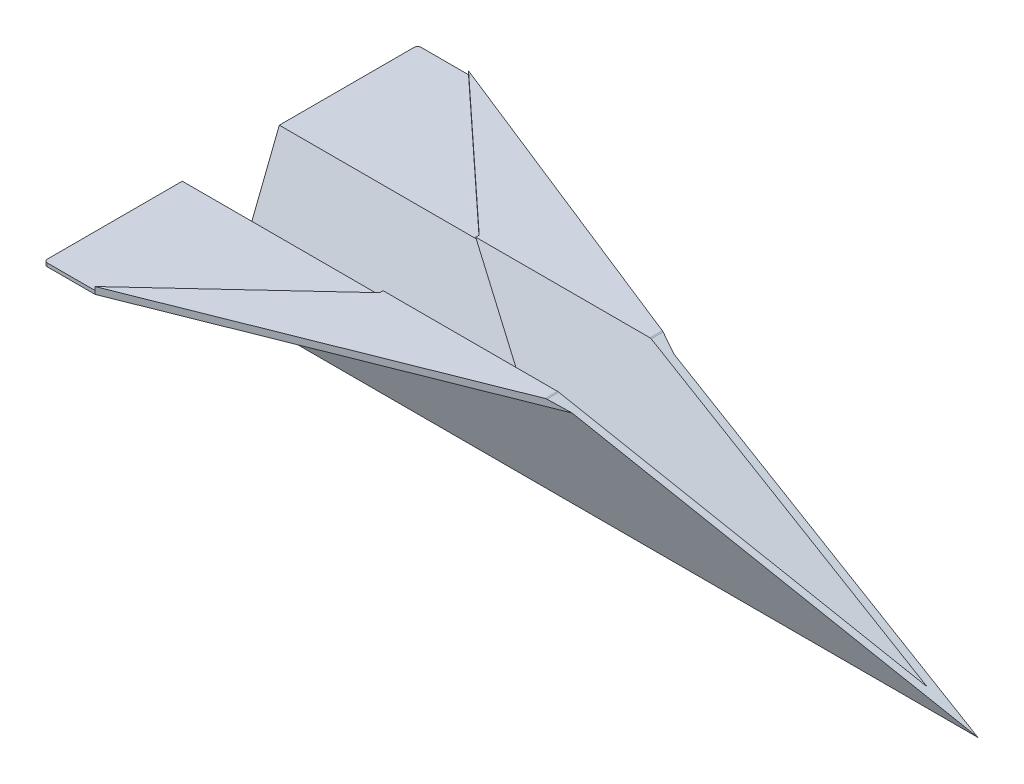
ISO-10303-21;
HEADER;
FILE_DESCRIPTION(('STEP AP214'),'2;1');
FILE_NAME('part.step','',(''),(''),'','','');
FILE_SCHEMA(('AUTOMOTIVE_DESIGN { 1 0 10303 214 1 1 1 1 }'));
ENDSEC;
DATA;
#1=APPLICATION_CONTEXT('core data for automotive mechanical design processes');
#2=APPLICATION_PROTOCOL_DEFINITION('international standard','automotive_design',2000,#1);
#3=PRODUCT_CONTEXT('',#1,'mechanical');
#4=PRODUCT('Part','Part','',(#3));
#5=PRODUCT_RELATED_PRODUCT_CATEGORY('part','',(#4));
#6=PRODUCT_DEFINITION_FORMATION('','',#4);
#7=PRODUCT_DEFINITION_CONTEXT('part definition',#1,'design');
#8=PRODUCT_DEFINITION('design','',#6,#7);
#9=PRODUCT_DEFINITION_SHAPE('','',#8);
#10=(LENGTH_UNIT() NAMED_UNIT(*) SI_UNIT(.MILLI.,.METRE.));
#11=(NAMED_UNIT(*) PLANE_ANGLE_UNIT() SI_UNIT($,.RADIAN.));
#12=(NAMED_UNIT(*) SI_UNIT($,.STERADIAN.) SOLID_ANGLE_UNIT());
#13=UNCERTAINTY_MEASURE_WITH_UNIT(LENGTH_MEASURE(1.E-05),#10,'distance_accuracy_value','');
#14=(GEOMETRIC_REPRESENTATION_CONTEXT(3) GLOBAL_UNCERTAINTY_ASSIGNED_CONTEXT((#13)) GLOBAL_UNIT_ASSIGNED_CONTEXT((#10,
#11,#12)) REPRESENTATION_CONTEXT('',''));
#15=CARTESIAN_POINT('',(0.,0.,0.));
#16=DIRECTION('',(0.,0.,1.));
#17=DIRECTION('',(1.,0.,0.));
#18=AXIS2_PLACEMENT_3D('',#15,#16,#17);
#19=CARTESIAN_POINT('',(279.4,0.,69.85));
#20=DIRECTION('',(0.,-1.,0.));
#21=DIRECTION('',(0.,0.,-1.));
#22=AXIS2_PLACEMENT_3D('',#19,#20,#21);
#23=PLANE('',#22);
#24=DIRECTION('',(0.929112902310387,0.,-0.369796180024035));
#25=VECTOR('',#24,1.);
#26=CARTESIAN_POINT('',(146.685,0.,19.05));
#27=LINE('',#26,#25);
#28=CARTESIAN_POINT('',(19.05,0.,69.85));
#29=VERTEX_POINT('',#28);
#30=CARTESIAN_POINT('',(139.476257778346,0.,21.9191511329964));
#31=VERTEX_POINT('',#30);
#32=EDGE_CURVE('E201',#29,#31,#27,.T.);
#33=ORIENTED_EDGE('',*,*,#32,.T.);
#34=DIRECTION('',(0.,0.,1.));
#35=VECTOR('',#34,1.);
#36=CARTESIAN_POINT('',(139.476257778346,0.,69.85));
#37=LINE('',#36,#35);
#38=CARTESIAN_POINT('',(139.476257778346,0.,17.3219045543068));
#39=VERTEX_POINT('',#38);
#40=EDGE_CURVE('E41',#31,#39,#37,.F.);
#41=ORIENTED_EDGE('',*,*,#40,.T.);
#42=DIRECTION('',(-1.,0.,0.));
#43=VECTOR('',#42,1.);
#44=CARTESIAN_POINT('',(279.4,0.,17.3219045543068));
#45=LINE('',#44,#43);
#46=CARTESIAN_POINT('',(74.2518042173273,0.,17.3219045543068));
#47=VERTEX_POINT('',#46);
#48=EDGE_CURVE('E262',#39,#47,#45,.T.);
#49=ORIENTED_EDGE('',*,*,#48,.T.);
#50=DIRECTION('',(0.,0.,-1.));
#51=VECTOR('',#50,1.);
#52=CARTESIAN_POINT('',(74.2518042173274,0.,69.85));
#53=LINE('',#52,#51);
#54=CARTESIAN_POINT('',(74.2518042173274,0.,18.640448736497));
#55=VERTEX_POINT('',#54);
#56=EDGE_CURVE('E212',#55,#47,#53,.T.);
#57=ORIENTED_EDGE('',*,*,#56,.F.);
#58=DIRECTION('',(0.733119661280728,0.,-0.680099670815705));
#59=VECTOR('',#58,1.);
#60=CARTESIAN_POINT('',(74.2518042173274,0.,18.640448736497));
#61=LINE('',#60,#59);
#62=EDGE_CURVE('E420',#29,#55,#61,.T.);
#63=ORIENTED_EDGE('',*,*,#62,.F.);
#64=EDGE_LOOP('',(#33,#41,#49,#57,#63));
#65=FACE_BOUND('',#64,.T.);
#66=ADVANCED_FACE('F33',(#65),#23,.F.);
#67=CARTESIAN_POINT('',(279.4,0.,17.3219045543068));
#68=DIRECTION('',(0.,-0.367166534736048,0.930155221331323));
#69=DIRECTION('',(0.,-0.930155221331323,-0.367166534736048));
#70=AXIS2_PLACEMENT_3D('',#67,#68,#69);
#71=PLANE('',#70);
#72=ORIENTED_EDGE('',*,*,#48,.F.);
#73=CARTESIAN_POINT('',(139.476257778346,-1.27,16.8205887648331));
#74=DIRECTION('',(0.,-0.367166534736048,0.930155221331323));
#75=DIRECTION('',(0.,0.930155221331323,0.367166534736048));
#76=AXIS2_PLACEMENT_3D('',#73,#74,#75);
#77=ELLIPSE('',#76,1.3653635123203,1.27);
#78=CARTESIAN_POINT('',(139.910271468467,-0.0764623521696817,17.2917220468713));
#79=VERTEX_POINT('',#78);
#80=EDGE_CURVE('E11',#39,#79,#77,.F.);
#81=ORIENTED_EDGE('',*,*,#80,.T.);
#82=DIRECTION('',(0.931357382673153,-0.338675411881146,-0.133687662584663));
#83=VECTOR('',#82,1.);
#84=CARTESIAN_POINT('',(260.879492424092,-44.0652699723971,-0.072280961113131));
#85=LINE('',#84,#83);
#86=CARTESIAN_POINT('',(260.375935061671,-43.8821582042438,0.));
#87=VERTEX_POINT('',#86);
#88=EDGE_CURVE('E227',#79,#87,#85,.T.);
#89=ORIENTED_EDGE('',*,*,#88,.T.);
#90=DIRECTION('',(-1.,0.,0.));
#91=VECTOR('',#90,1.);
#92=CARTESIAN_POINT('',(279.4,-43.8821582042438,0.));
#93=LINE('',#92,#91);
#94=CARTESIAN_POINT('',(118.133962421571,-43.8821582042438,0.));
#95=VERTEX_POINT('',#94);
#96=EDGE_CURVE('E245',#87,#95,#93,.T.);
#97=ORIENTED_EDGE('',*,*,#96,.T.);
#98=DIRECTION('',(0.681073584212537,-0.681073584212535,-0.268844835873369));
#99=VECTOR('',#98,1.);
#100=CARTESIAN_POINT('',(169.412098052914,-95.1602938355861,-20.2413693281614));
#101=LINE('',#100,#99);
#102=EDGE_CURVE('E337',#47,#95,#101,.T.);
#103=ORIENTED_EDGE('',*,*,#102,.F.);
#104=EDGE_LOOP('',(#72,#81,#89,#97,#103));
#105=FACE_BOUND('',#104,.T.);
#106=ADVANCED_FACE('F354',(#105),#71,.F.);
#107=CARTESIAN_POINT('',(279.4,0.,-17.3219045543068));
#108=DIRECTION('',(0.,-1.,0.));
#109=DIRECTION('',(0.,0.,-1.));
#110=AXIS2_PLACEMENT_3D('',#107,#108,#109);
#111=PLANE('',#110);
#112=DIRECTION('',(-1.,0.,0.));
#113=VECTOR('',#112,1.);
#114=CARTESIAN_POINT('',(279.4,0.,-17.3219045543068));
#115=LINE('',#114,#113);
#116=CARTESIAN_POINT('',(139.476257778346,0.,-17.3219045543068));
#117=VERTEX_POINT('',#116);
#118=CARTESIAN_POINT('',(74.2518042173274,0.,-17.3219045543068));
#119=VERTEX_POINT('',#118);
#120=EDGE_CURVE('E248',#117,#119,#115,.T.);
#121=ORIENTED_EDGE('',*,*,#120,.F.);
#122=DIRECTION('',(0.,0.,1.));
#123=VECTOR('',#122,1.);
#124=CARTESIAN_POINT('',(139.476257778346,0.,-17.3219045543068));
#125=LINE('',#124,#123);
#126=CARTESIAN_POINT('',(139.476257778346,0.,-21.9191511329964));
#127=VERTEX_POINT('',#126);
#128=EDGE_CURVE('E304',#117,#127,#125,.F.);
#129=ORIENTED_EDGE('',*,*,#128,.T.);
#130=DIRECTION('',(0.929112902310387,0.,0.369796180024035));
#131=VECTOR('',#130,1.);
#132=CARTESIAN_POINT('',(146.685,0.,-19.05));
#133=LINE('',#132,#131);
#134=CARTESIAN_POINT('',(19.05,0.,-69.85));
#135=VERTEX_POINT('',#134);
#136=EDGE_CURVE('E210',#135,#127,#133,.T.);
#137=ORIENTED_EDGE('',*,*,#136,.F.);
#138=DIRECTION('',(-0.733119661280728,0.,-0.680099670815705));
#139=VECTOR('',#138,1.);
#140=CARTESIAN_POINT('',(19.05,0.,-69.85));
#141=LINE('',#140,#139);
#142=CARTESIAN_POINT('',(74.2518042173274,0.,-18.6404487364971));
#143=VERTEX_POINT('',#142);
#144=EDGE_CURVE('E333',#143,#135,#141,.T.);
#145=ORIENTED_EDGE('',*,*,#144,.F.);
#146=DIRECTION('',(0.,0.,-1.));
#147=VECTOR('',#146,1.);
#148=CARTESIAN_POINT('',(74.2518042173274,0.,-17.3219045543068));
#149=LINE('',#148,#147);
#150=EDGE_CURVE('E332',#119,#143,#149,.T.);
#151=ORIENTED_EDGE('',*,*,#150,.F.);
#152=EDGE_LOOP('',(#121,#129,#137,#145,#151));
#153=FACE_BOUND('',#152,.T.);
#154=ADVANCED_FACE('F329',(#153),#111,.F.);
#155=CARTESIAN_POINT('',(279.4,-43.8821582042438,0.));
#156=DIRECTION('',(0.,-0.367166534736049,-0.930155221331323));
#157=DIRECTION('',(0.,0.930155221331323,-0.367166534736049));
#158=AXIS2_PLACEMENT_3D('',#155,#156,#157);
#159=PLANE('',#158);
#160=DIRECTION('',(-0.931357382673153,0.338675411881146,-0.133687662584663));
#161=VECTOR('',#160,1.);
#162=CARTESIAN_POINT('',(276.877914539621,-49.8828780144078,2.36870518822261));
#163=LINE('',#162,#161);
#164=CARTESIAN_POINT('',(139.910271468467,-0.0764623521696747,-17.2917220468714));
#165=VERTEX_POINT('',#164);
#166=EDGE_CURVE('E224',#87,#165,#163,.T.);
#167=ORIENTED_EDGE('',*,*,#166,.T.);
#168=CARTESIAN_POINT('',(139.476257778346,-1.27,-16.8205887648331));
#169=DIRECTION('',(0.,-0.367166534736049,-0.930155221331323));
#170=DIRECTION('',(0.,-0.930155221331323,0.367166534736049));
#171=AXIS2_PLACEMENT_3D('',#168,#169,#170);
#172=ELLIPSE('',#171,1.3653635123203,1.27);
#173=EDGE_CURVE('E302',#165,#117,#172,.F.);
#174=ORIENTED_EDGE('',*,*,#173,.T.);
#175=ORIENTED_EDGE('',*,*,#120,.T.);
#176=DIRECTION('',(-0.681073584212537,0.681073584212535,-0.268844835873369));
#177=VECTOR('',#176,1.);
#178=CARTESIAN_POINT('',(192.939024504209,-118.687220286881,29.5283139799886));
#179=LINE('',#178,#177);
#180=EDGE_CURVE('E272',#95,#119,#179,.T.);
#181=ORIENTED_EDGE('',*,*,#180,.F.);
#182=ORIENTED_EDGE('',*,*,#96,.F.);
#183=EDGE_LOOP('',(#167,#174,#175,#181,#182));
#184=FACE_BOUND('',#183,.T.);
#185=ADVANCED_FACE('F324',(#184),#159,.F.);
#186=CARTESIAN_POINT('',(0.,0.,0.));
#187=DIRECTION('',(1.,0.,0.));
#188=DIRECTION('',(0.,0.,-1.));
#189=AXIS2_PLACEMENT_3D('',#186,#187,#188);
#190=PLANE('',#189);
#191=DIRECTION('',(0.,0.,1.));
#192=VECTOR('',#191,1.);
#193=CARTESIAN_POINT('',(0.,-1.27,69.85));
#194=LINE('',#193,#192);
#195=CARTESIAN_POINT('',(0.,-1.27,-68.58));
#196=VERTEX_POINT('',#195);
#197=CARTESIAN_POINT('',(0.,-1.26999999999999,-18.1391329470234));
#198=VERTEX_POINT('',#197);
#199=EDGE_CURVE('E186',#196,#198,#194,.T.);
#200=ORIENTED_EDGE('',*,*,#199,.F.);
#201=DIRECTION('',(0.,1.,0.));
#202=VECTOR('',#201,1.);
#203=CARTESIAN_POINT('',(0.,0.,-68.58));
#204=LINE('',#203,#202);
#205=CARTESIAN_POINT('',(0.,-2.54,-68.58));
#206=VERTEX_POINT('',#205);
#207=EDGE_CURVE('E287',#196,#206,#204,.F.);
#208=ORIENTED_EDGE('',*,*,#207,.T.);
#209=DIRECTION('',(0.,0.,-1.));
#210=VECTOR('',#209,1.);
#211=CARTESIAN_POINT('',(0.,-2.54,-19.05));
#212=LINE('',#211,#210);
#213=CARTESIAN_POINT('',(0.,-2.54,-19.05));
#214=VERTEX_POINT('',#213);
#215=EDGE_CURVE('E242',#214,#206,#212,.T.);
#216=ORIENTED_EDGE('',*,*,#215,.F.);
#217=DIRECTION('',(0.,0.930155221331323,-0.367166534736049));
#218=VECTOR('',#217,1.);
#219=CARTESIAN_POINT('',(0.,-50.8,0.));
#220=LINE('',#219,#218);
#221=CARTESIAN_POINT('',(0.,-50.8,0.));
#222=VERTEX_POINT('',#221);
#223=EDGE_CURVE('E239',#222,#214,#220,.T.);
#224=ORIENTED_EDGE('',*,*,#223,.F.);
#225=DIRECTION('',(0.,-0.930155221331323,-0.367166534736048));
#226=VECTOR('',#225,1.);
#227=CARTESIAN_POINT('',(0.,-2.54,19.05));
#228=LINE('',#227,#226);
#229=CARTESIAN_POINT('',(0.,-2.54,19.05));
#230=VERTEX_POINT('',#229);
#231=EDGE_CURVE('E237',#230,#222,#228,.T.);
#232=ORIENTED_EDGE('',*,*,#231,.F.);
#233=DIRECTION('',(0.,0.,-1.));
#234=VECTOR('',#233,1.);
#235=CARTESIAN_POINT('',(0.,-2.54,69.85));
#236=LINE('',#235,#234);
#237=CARTESIAN_POINT('',(0.,-2.54,68.58));
#238=VERTEX_POINT('',#237);
#239=EDGE_CURVE('E235',#238,#230,#236,.T.);
#240=ORIENTED_EDGE('',*,*,#239,.F.);
#241=DIRECTION('',(0.,-1.,0.));
#242=VECTOR('',#241,1.);
#243=CARTESIAN_POINT('',(0.,0.,68.58));
#244=LINE('',#243,#242);
#245=CARTESIAN_POINT('',(0.,-1.27,68.58));
#246=VERTEX_POINT('',#245);
#247=EDGE_CURVE('E285',#238,#246,#244,.F.);
#248=ORIENTED_EDGE('',*,*,#247,.T.);
#249=CARTESIAN_POINT('',(0.,-1.27,18.1391329470233));
#250=VERTEX_POINT('',#249);
#251=EDGE_CURVE('E423',#250,#246,#194,.T.);
#252=ORIENTED_EDGE('',*,*,#251,.F.);
#253=DIRECTION('',(0.,0.930155221331323,0.367166534736048));
#254=VECTOR('',#253,1.);
#255=CARTESIAN_POINT('',(0.,-6.36612089862391,16.1275062765139));
#256=LINE('',#255,#254);
#257=CARTESIAN_POINT('',(0.,-47.2224701324592,0.));
#258=VERTEX_POINT('',#257);
#259=EDGE_CURVE('E269',#258,#250,#256,.T.);
#260=ORIENTED_EDGE('',*,*,#259,.F.);
#261=DIRECTION('',(0.,0.930155221331323,-0.367166534736049));
#262=VECTOR('',#261,1.);
#263=CARTESIAN_POINT('',(0.,-47.2224701324592,0.));
#264=LINE('',#263,#262);
#265=EDGE_CURVE('E338',#258,#198,#264,.T.);
#266=ORIENTED_EDGE('',*,*,#265,.T.);
#267=EDGE_LOOP('',(#200,#208,#216,#224,#232,#240,#248,#252,#260,#266));
#268=FACE_BOUND('',#267,.T.);
#269=ADVANCED_FACE('F398',(#268),#190,.F.);
#270=CARTESIAN_POINT('',(279.4,0.,69.85));
#271=DIRECTION('',(0.,0.,-1.));
#272=DIRECTION('',(-1.,0.,0.));
#273=AXIS2_PLACEMENT_3D('',#270,#271,#272);
#274=PLANE('',#273);
#275=DIRECTION('',(1.,0.,0.));
#276=VECTOR('',#275,1.);
#277=CARTESIAN_POINT('',(19.05,-1.27,69.85));
#278=LINE('',#277,#276);
#279=CARTESIAN_POINT('',(1.27,-1.27,69.85));
#280=VERTEX_POINT('',#279);
#281=CARTESIAN_POINT('',(19.05,-1.27,69.85));
#282=VERTEX_POINT('',#281);
#283=EDGE_CURVE('E175',#280,#282,#278,.T.);
#284=ORIENTED_EDGE('',*,*,#283,.F.);
#285=DIRECTION('',(0.,-1.,0.));
#286=VECTOR('',#285,1.);
#287=CARTESIAN_POINT('',(1.26999999999999,0.,69.85));
#288=LINE('',#287,#286);
#289=CARTESIAN_POINT('',(1.26999999999999,-2.54,69.85));
#290=VERTEX_POINT('',#289);
#291=EDGE_CURVE('E291',#280,#290,#288,.T.);
#292=ORIENTED_EDGE('',*,*,#291,.T.);
#293=DIRECTION('',(-1.,0.,0.));
#294=VECTOR('',#293,1.);
#295=CARTESIAN_POINT('',(279.4,-2.54,69.85));
#296=LINE('',#295,#294);
#297=CARTESIAN_POINT('',(19.05,-2.54,69.85));
#298=VERTEX_POINT('',#297);
#299=EDGE_CURVE('E207',#298,#290,#296,.T.);
#300=ORIENTED_EDGE('',*,*,#299,.F.);
#301=DIRECTION('',(0.,1.,0.));
#302=VECTOR('',#301,1.);
#303=CARTESIAN_POINT('',(19.05,-50.8,69.85));
#304=LINE('',#303,#302);
#305=EDGE_CURVE('E199',#298,#282,#304,.T.);
#306=ORIENTED_EDGE('',*,*,#305,.T.);
#307=EDGE_LOOP('',(#284,#292,#300,#306));
#308=FACE_BOUND('',#307,.T.);
#309=ADVANCED_FACE('F205',(#308),#274,.F.);
#310=CARTESIAN_POINT('',(279.4,-2.54,69.85));
#311=DIRECTION('',(0.,1.,0.));
#312=DIRECTION('',(0.,0.,1.));
#313=AXIS2_PLACEMENT_3D('',#310,#311,#312);
#314=PLANE('',#313);
#315=ORIENTED_EDGE('',*,*,#299,.T.);
#316=CARTESIAN_POINT('',(1.26999999999999,-2.54,68.58));
#317=DIRECTION('',(0.,1.,0.));
#318=DIRECTION('',(0.,0.,1.));
#319=AXIS2_PLACEMENT_3D('',#316,#317,#318);
#320=CIRCLE('',#319,1.27);
#321=EDGE_CURVE('E293',#290,#238,#320,.F.);
#322=ORIENTED_EDGE('',*,*,#321,.T.);
#323=ORIENTED_EDGE('',*,*,#239,.T.);
#324=DIRECTION('',(-1.,0.,0.));
#325=VECTOR('',#324,1.);
#326=CARTESIAN_POINT('',(279.4,-2.54,19.05));
#327=LINE('',#326,#325);
#328=CARTESIAN_POINT('',(146.685,-2.54,19.05));
#329=VERTEX_POINT('',#328);
#330=EDGE_CURVE('E258',#329,#230,#327,.T.);
#331=ORIENTED_EDGE('',*,*,#330,.F.);
#332=DIRECTION('',(0.929112902310387,0.,-0.369796180024035));
#333=VECTOR('',#332,1.);
#334=CARTESIAN_POINT('',(243.797341937138,-2.54,-19.6016783829406));
#335=LINE('',#334,#333);
#336=EDGE_CURVE('E208',#298,#329,#335,.T.);
#337=ORIENTED_EDGE('',*,*,#336,.F.);
#338=EDGE_LOOP('',(#315,#322,#323,#331,#337));
#339=FACE_BOUND('',#338,.T.);
#340=ADVANCED_FACE('F385',(#339),#314,.F.);
#341=CARTESIAN_POINT('',(139.7,0.,-69.85));
#342=DIRECTION('',(-0.341743063086704,-0.939793423488437,0.));
#343=DIRECTION('',(0.939793423488437,-0.341743063086704,0.));
#344=AXIS2_PLACEMENT_3D('',#341,#342,#343);
#345=PLANE('',#344);
#346=DIRECTION('',(-0.880231447134228,0.320084162594265,-0.350340874481285));
#347=VECTOR('',#346,1.);
#348=CARTESIAN_POINT('',(124.891572426707,5.38488275392484,-27.7240010241964));
#349=LINE('',#348,#347);
#350=CARTESIAN_POINT('',(146.685,-2.54,-19.05));
#351=VERTEX_POINT('',#350);
#352=CARTESIAN_POINT('',(139.910271468467,-0.0764623521696843,-21.7464093657844));
#353=VERTEX_POINT('',#352);
#354=EDGE_CURVE('E264',#351,#353,#349,.T.);
#355=ORIENTED_EDGE('',*,*,#354,.T.);
#356=DIRECTION('',(0.,0.,1.));
#357=VECTOR('',#356,1.);
#358=CARTESIAN_POINT('',(139.910271468467,-0.0764623521696838,-69.85));
#359=LINE('',#358,#357);
#360=EDGE_CURVE('E299',#353,#165,#359,.T.);
#361=ORIENTED_EDGE('',*,*,#360,.T.);
#362=ORIENTED_EDGE('',*,*,#166,.F.);
#363=ORIENTED_EDGE('',*,*,#88,.F.);
#364=DIRECTION('',(0.,0.,1.));
#365=VECTOR('',#364,1.);
#366=CARTESIAN_POINT('',(139.910271468467,-0.0764623521696838,-69.85));
#367=LINE('',#366,#365);
#368=CARTESIAN_POINT('',(139.910271468467,-0.0764623521696851,21.7464093657844));
#369=VERTEX_POINT('',#368);
#370=EDGE_CURVE('E296',#79,#369,#367,.T.);
#371=ORIENTED_EDGE('',*,*,#370,.T.);
#372=DIRECTION('',(-0.880231447134228,0.320084162594265,0.350340874481285));
#373=VECTOR('',#372,1.);
#374=CARTESIAN_POINT('',(167.972405801117,-10.2808748367697,10.5774006761725));
#375=LINE('',#374,#373);
#376=EDGE_CURVE('E267',#329,#369,#375,.T.);
#377=ORIENTED_EDGE('',*,*,#376,.F.);
#378=DIRECTION('',(-0.931357382673153,0.338675411881146,0.133687662584663));
#379=VECTOR('',#378,1.);
#380=CARTESIAN_POINT('',(261.805517802887,-44.4020064737772,2.52552376035109));
#381=LINE('',#380,#379);
#382=CARTESIAN_POINT('',(279.4,-50.8,0.));
#383=VERTEX_POINT('',#382);
#384=EDGE_CURVE('E232',#383,#329,#381,.T.);
#385=ORIENTED_EDGE('',*,*,#384,.F.);
#386=DIRECTION('',(0.931357382673153,-0.338675411881146,0.133687662584663));
#387=VECTOR('',#386,1.);
#388=CARTESIAN_POINT('',(279.4,-50.8,0.));
#389=LINE('',#388,#387);
#390=EDGE_CURVE('E229',#351,#383,#389,.T.);
#391=ORIENTED_EDGE('',*,*,#390,.F.);
#392=EDGE_LOOP('',(#355,#361,#362,#363,#371,#377,#385,#391));
#393=FACE_BOUND('',#392,.T.);
#394=ADVANCED_FACE('F318',(#393),#345,.F.);
#395=CARTESIAN_POINT('',(279.4,-2.54,19.05));
#396=DIRECTION('',(0.,0.367166534736048,-0.930155221331323));
#397=DIRECTION('',(0.,0.930155221331323,0.367166534736048));
#398=AXIS2_PLACEMENT_3D('',#395,#396,#397);
#399=PLANE('',#398);
#400=DIRECTION('',(-1.,0.,0.));
#401=VECTOR('',#400,1.);
#402=CARTESIAN_POINT('',(279.4,-50.8,0.));
#403=LINE('',#402,#401);
#404=EDGE_CURVE('E255',#383,#222,#403,.T.);
#405=ORIENTED_EDGE('',*,*,#404,.F.);
#406=ORIENTED_EDGE('',*,*,#384,.T.);
#407=ORIENTED_EDGE('',*,*,#330,.T.);
#408=ORIENTED_EDGE('',*,*,#231,.T.);
#409=EDGE_LOOP('',(#405,#406,#407,#408));
#410=FACE_BOUND('',#409,.T.);
#411=ADVANCED_FACE('F390',(#410),#399,.F.);
#412=CARTESIAN_POINT('',(279.4,-50.8,0.));
#413=DIRECTION('',(0.,0.367166534736049,0.930155221331323));
#414=DIRECTION('',(0.,-0.930155221331323,0.367166534736049));
#415=AXIS2_PLACEMENT_3D('',#412,#413,#414);
#416=PLANE('',#415);
#417=DIRECTION('',(-1.,0.,0.));
#418=VECTOR('',#417,1.);
#419=CARTESIAN_POINT('',(279.4,-2.54,-19.05));
#420=LINE('',#419,#418);
#421=EDGE_CURVE('E253',#351,#214,#420,.T.);
#422=ORIENTED_EDGE('',*,*,#421,.F.);
#423=ORIENTED_EDGE('',*,*,#390,.T.);
#424=ORIENTED_EDGE('',*,*,#404,.T.);
#425=ORIENTED_EDGE('',*,*,#223,.T.);
#426=EDGE_LOOP('',(#422,#423,#424,#425));
#427=FACE_BOUND('',#426,.T.);
#428=ADVANCED_FACE('F394',(#427),#416,.F.);
#429=CARTESIAN_POINT('',(279.4,-2.54,-19.05));
#430=DIRECTION('',(0.,1.,0.));
#431=DIRECTION('',(0.,0.,1.));
#432=AXIS2_PLACEMENT_3D('',#429,#430,#431);
#433=PLANE('',#432);
#434=ORIENTED_EDGE('',*,*,#215,.T.);
#435=CARTESIAN_POINT('',(1.26999999999999,-2.54,-68.58));
#436=DIRECTION('',(0.,1.,0.));
#437=DIRECTION('',(0.,0.,1.));
#438=AXIS2_PLACEMENT_3D('',#435,#436,#437);
#439=CIRCLE('',#438,1.27);
#440=CARTESIAN_POINT('',(1.26999999999999,-2.54,-69.85));
#441=VERTEX_POINT('',#440);
#442=EDGE_CURVE('E289',#206,#441,#439,.F.);
#443=ORIENTED_EDGE('',*,*,#442,.T.);
#444=DIRECTION('',(-1.,0.,0.));
#445=VECTOR('',#444,1.);
#446=CARTESIAN_POINT('',(279.4,-2.54,-69.85));
#447=LINE('',#446,#445);
#448=CARTESIAN_POINT('',(19.05,-2.54,-69.85));
#449=VERTEX_POINT('',#448);
#450=EDGE_CURVE('E250',#449,#441,#447,.T.);
#451=ORIENTED_EDGE('',*,*,#450,.F.);
#452=DIRECTION('',(0.929112902310387,0.,0.369796180024035));
#453=VECTOR('',#452,1.);
#454=CARTESIAN_POINT('',(261.251327963078,-2.54,26.5485384927673));
#455=LINE('',#454,#453);
#456=EDGE_CURVE('E221',#449,#351,#455,.T.);
#457=ORIENTED_EDGE('',*,*,#456,.T.);
#458=ORIENTED_EDGE('',*,*,#421,.T.);
#459=EDGE_LOOP('',(#434,#443,#451,#457,#458));
#460=FACE_BOUND('',#459,.T.);
#461=ADVANCED_FACE('F402',(#460),#433,.F.);
#462=CARTESIAN_POINT('',(279.4,-2.54,-69.85));
#463=DIRECTION('',(0.,0.,1.));
#464=DIRECTION('',(1.,0.,0.));
#465=AXIS2_PLACEMENT_3D('',#462,#463,#464);
#466=PLANE('',#465);
#467=ORIENTED_EDGE('',*,*,#450,.T.);
#468=DIRECTION('',(0.,1.,0.));
#469=VECTOR('',#468,1.);
#470=CARTESIAN_POINT('',(1.26999999999999,-2.54,-69.85));
#471=LINE('',#470,#469);
#472=CARTESIAN_POINT('',(1.26999999999999,-1.27,-69.85));
#473=VERTEX_POINT('',#472);
#474=EDGE_CURVE('E280',#441,#473,#471,.T.);
#475=ORIENTED_EDGE('',*,*,#474,.T.);
#476=DIRECTION('',(-1.,0.,0.));
#477=VECTOR('',#476,1.);
#478=CARTESIAN_POINT('',(0.,-1.27,-69.85));
#479=LINE('',#478,#477);
#480=CARTESIAN_POINT('',(19.05,-1.27,-69.85));
#481=VERTEX_POINT('',#480);
#482=EDGE_CURVE('E202',#481,#473,#479,.T.);
#483=ORIENTED_EDGE('',*,*,#482,.F.);
#484=DIRECTION('',(0.,1.,0.));
#485=VECTOR('',#484,1.);
#486=CARTESIAN_POINT('',(19.05,-50.8,-69.85));
#487=LINE('',#486,#485);
#488=EDGE_CURVE('E218',#449,#481,#487,.T.);
#489=ORIENTED_EDGE('',*,*,#488,.F.);
#490=EDGE_LOOP('',(#467,#475,#483,#489));
#491=FACE_BOUND('',#490,.T.);
#492=ADVANCED_FACE('F408',(#491),#466,.F.);
#493=CARTESIAN_POINT('',(146.685,-50.8,-19.05));
#494=DIRECTION('',(-0.369796180024035,0.,0.929112902310387));
#495=DIRECTION('',(0.929112902310387,0.,0.369796180024035));
#496=AXIS2_PLACEMENT_3D('',#493,#494,#495);
#497=PLANE('',#496);
#498=ORIENTED_EDGE('',*,*,#136,.T.);
#499=CARTESIAN_POINT('',(139.476257778346,-1.27,-21.9191511329964));
#500=DIRECTION('',(-0.369796180024035,0.,0.929112902310387));
#501=DIRECTION('',(0.929112902310388,0.,0.369796180024035));
#502=AXIS2_PLACEMENT_3D('',#499,#500,#501);
#503=ELLIPSE('',#502,1.3668952361354,1.27);
#504=EDGE_CURVE('E306',#127,#353,#503,.F.);
#505=ORIENTED_EDGE('',*,*,#504,.T.);
#506=ORIENTED_EDGE('',*,*,#354,.F.);
#507=ORIENTED_EDGE('',*,*,#456,.F.);
#508=ORIENTED_EDGE('',*,*,#488,.T.);
#509=DIRECTION('',(0.,1.,0.));
#510=VECTOR('',#509,1.);
#511=CARTESIAN_POINT('',(19.05,-1.27,-69.85));
#512=LINE('',#511,#510);
#513=EDGE_CURVE('E424',#481,#135,#512,.T.);
#514=ORIENTED_EDGE('',*,*,#513,.T.);
#515=EDGE_LOOP('',(#498,#505,#506,#507,#508,#514));
#516=FACE_BOUND('',#515,.T.);
#517=ADVANCED_FACE('F310',(#516),#497,.F.);
#518=CARTESIAN_POINT('',(146.685,-50.8,19.05));
#519=DIRECTION('',(0.369796180024035,0.,0.929112902310387));
#520=DIRECTION('',(0.929112902310387,0.,-0.369796180024035));
#521=AXIS2_PLACEMENT_3D('',#518,#519,#520);
#522=PLANE('',#521);
#523=ORIENTED_EDGE('',*,*,#376,.T.);
#524=CARTESIAN_POINT('',(139.476257778346,-1.27,21.9191511329964));
#525=DIRECTION('',(0.369796180024035,0.,0.929112902310387));
#526=DIRECTION('',(-0.929112902310388,0.,0.369796180024035));
#527=AXIS2_PLACEMENT_3D('',#524,#525,#526);
#528=ELLIPSE('',#527,1.3668952361354,1.27);
#529=EDGE_CURVE('E55',#369,#31,#528,.T.);
#530=ORIENTED_EDGE('',*,*,#529,.T.);
#531=ORIENTED_EDGE('',*,*,#32,.F.);
#532=DIRECTION('',(0.,1.,0.));
#533=VECTOR('',#532,1.);
#534=CARTESIAN_POINT('',(19.05,-1.27,69.85));
#535=LINE('',#534,#533);
#536=EDGE_CURVE('E192',#282,#29,#535,.T.);
#537=ORIENTED_EDGE('',*,*,#536,.F.);
#538=ORIENTED_EDGE('',*,*,#305,.F.);
#539=ORIENTED_EDGE('',*,*,#336,.T.);
#540=EDGE_LOOP('',(#523,#530,#531,#537,#538,#539));
#541=FACE_BOUND('',#540,.T.);
#542=ADVANCED_FACE('F198',(#541),#522,.T.);
#543=CARTESIAN_POINT('',(37.1259021086636,37.1259021086637,0.));
#544=DIRECTION('',(-0.707106781186546,-0.707106781186549,0.));
#545=DIRECTION('',(0.707106781186549,-0.707106781186546,0.));
#546=AXIS2_PLACEMENT_3D('',#543,#544,#545);
#547=PLANE('',#546);
#548=ORIENTED_EDGE('',*,*,#56,.T.);
#549=ORIENTED_EDGE('',*,*,#102,.T.);
#550=ORIENTED_EDGE('',*,*,#180,.T.);
#551=ORIENTED_EDGE('',*,*,#150,.T.);
#552=DIRECTION('',(-0.681073584212537,0.681073584212535,-0.268844835873369));
#553=VECTOR('',#552,1.);
#554=CARTESIAN_POINT('',(121.474274349787,-47.2224701324592,0.));
#555=LINE('',#554,#553);
#556=CARTESIAN_POINT('',(121.474274349787,-47.2224701324592,0.));
#557=VERTEX_POINT('',#556);
#558=EDGE_CURVE('E345',#557,#143,#555,.T.);
#559=ORIENTED_EDGE('',*,*,#558,.F.);
#560=DIRECTION('',(0.681073584212538,-0.681073584212535,-0.268844835873369));
#561=VECTOR('',#560,1.);
#562=CARTESIAN_POINT('',(73.3537786052205,0.898025612106911,18.9949325307498));
#563=LINE('',#562,#561);
#564=EDGE_CURVE('E352',#55,#557,#563,.T.);
#565=ORIENTED_EDGE('',*,*,#564,.F.);
#566=EDGE_LOOP('',(#548,#549,#550,#551,#559,#565));
#567=FACE_BOUND('',#566,.T.);
#568=ADVANCED_FACE('F351',(#567),#547,.T.);
#569=CARTESIAN_POINT('',(121.474274349787,-47.2224701324592,0.));
#570=DIRECTION('',(0.,0.367166534736049,0.930155221331323));
#571=DIRECTION('',(0.,-0.930155221331323,0.367166534736049));
#572=AXIS2_PLACEMENT_3D('',#569,#570,#571);
#573=PLANE('',#572);
#574=DIRECTION('',(0.,0.930155221331323,-0.367166534736049));
#575=VECTOR('',#574,1.);
#576=CARTESIAN_POINT('',(74.2518042173274,-47.2224701324592,0.));
#577=LINE('',#576,#575);
#578=CARTESIAN_POINT('',(74.2518042173274,-1.27,-18.1391329470234));
#579=VERTEX_POINT('',#578);
#580=EDGE_CURVE('E432',#579,#143,#577,.T.);
#581=ORIENTED_EDGE('',*,*,#580,.F.);
#582=DIRECTION('',(1.,0.,0.));
#583=VECTOR('',#582,1.);
#584=CARTESIAN_POINT('',(121.474274349787,-1.27,-18.1391329470234));
#585=LINE('',#584,#583);
#586=EDGE_CURVE('E426',#198,#579,#585,.T.);
#587=ORIENTED_EDGE('',*,*,#586,.F.);
#588=ORIENTED_EDGE('',*,*,#265,.F.);
#589=DIRECTION('',(-1.,0.,0.));
#590=VECTOR('',#589,1.);
#591=CARTESIAN_POINT('',(121.474274349787,-47.2224701324592,0.));
#592=LINE('',#591,#590);
#593=EDGE_CURVE('E342',#557,#258,#592,.T.);
#594=ORIENTED_EDGE('',*,*,#593,.F.);
#595=ORIENTED_EDGE('',*,*,#558,.T.);
#596=EDGE_LOOP('',(#581,#587,#588,#594,#595));
#597=FACE_BOUND('',#596,.T.);
#598=ADVANCED_FACE('F439',(#597),#573,.T.);
#599=CARTESIAN_POINT('',(73.3537786052205,0.898025612106911,18.9949325307498));
#600=DIRECTION('',(0.,0.367166534736048,-0.930155221331323));
#601=DIRECTION('',(0.,0.930155221331323,0.367166534736048));
#602=AXIS2_PLACEMENT_3D('',#599,#600,#601);
#603=PLANE('',#602);
#604=DIRECTION('',(0.,-0.930155221331323,-0.367166534736048));
#605=VECTOR('',#604,1.);
#606=CARTESIAN_POINT('',(74.2518042173274,0.898025612106911,18.9949325307498));
#607=LINE('',#606,#605);
#608=CARTESIAN_POINT('',(74.2518042173274,-1.27,18.1391329470233));
#609=VERTEX_POINT('',#608);
#610=EDGE_CURVE('E277',#55,#609,#607,.T.);
#611=ORIENTED_EDGE('',*,*,#610,.F.);
#612=ORIENTED_EDGE('',*,*,#564,.T.);
#613=ORIENTED_EDGE('',*,*,#593,.T.);
#614=ORIENTED_EDGE('',*,*,#259,.T.);
#615=DIRECTION('',(-1.,0.,0.));
#616=VECTOR('',#615,1.);
#617=CARTESIAN_POINT('',(73.3537786052205,-1.27,18.1391329470233));
#618=LINE('',#617,#616);
#619=EDGE_CURVE('E275',#609,#250,#618,.T.);
#620=ORIENTED_EDGE('',*,*,#619,.F.);
#621=EDGE_LOOP('',(#611,#612,#613,#614,#620));
#622=FACE_BOUND('',#621,.T.);
#623=ADVANCED_FACE('F445',(#622),#603,.T.);
#624=CARTESIAN_POINT('',(0.,-1.27,0.));
#625=DIRECTION('',(0.,-1.,0.));
#626=DIRECTION('',(0.,0.,-1.));
#627=AXIS2_PLACEMENT_3D('',#624,#625,#626);
#628=PLANE('',#627);
#629=ORIENTED_EDGE('',*,*,#251,.T.);
#630=CARTESIAN_POINT('',(1.26999999999999,-1.27,68.58));
#631=DIRECTION('',(0.,-1.,0.));
#632=DIRECTION('',(0.,0.,-1.));
#633=AXIS2_PLACEMENT_3D('',#630,#631,#632);
#634=CIRCLE('',#633,1.27);
#635=EDGE_CURVE('E181',#246,#280,#634,.F.);
#636=ORIENTED_EDGE('',*,*,#635,.T.);
#637=ORIENTED_EDGE('',*,*,#283,.T.);
#638=DIRECTION('',(0.733119661280728,0.,-0.680099670815705));
#639=VECTOR('',#638,1.);
#640=CARTESIAN_POINT('',(74.2518042173274,-1.27,18.640448736497));
#641=LINE('',#640,#639);
#642=CARTESIAN_POINT('',(74.2518042173274,-1.27,18.640448736497));
#643=VERTEX_POINT('',#642);
#644=EDGE_CURVE('E179',#282,#643,#641,.T.);
#645=ORIENTED_EDGE('',*,*,#644,.T.);
#646=DIRECTION('',(0.,0.,-1.));
#647=VECTOR('',#646,1.);
#648=CARTESIAN_POINT('',(74.2518042173274,-1.27,-18.6404487364971));
#649=LINE('',#648,#647);
#650=EDGE_CURVE('E416',#643,#609,#649,.T.);
#651=ORIENTED_EDGE('',*,*,#650,.T.);
#652=ORIENTED_EDGE('',*,*,#619,.T.);
#653=EDGE_LOOP('',(#629,#636,#637,#645,#651,#652));
#654=FACE_BOUND('',#653,.T.);
#655=ADVANCED_FACE('F178',(#654),#628,.F.);
#656=CARTESIAN_POINT('',(74.2518042173274,-1.27,-18.6404487364971));
#657=DIRECTION('',(1.,0.,0.));
#658=DIRECTION('',(0.,0.,-1.));
#659=AXIS2_PLACEMENT_3D('',#656,#657,#658);
#660=PLANE('',#659);
#661=ORIENTED_EDGE('',*,*,#610,.T.);
#662=ORIENTED_EDGE('',*,*,#650,.F.);
#663=DIRECTION('',(0.,1.,0.));
#664=VECTOR('',#663,1.);
#665=CARTESIAN_POINT('',(74.2518042173274,-1.27,18.640448736497));
#666=LINE('',#665,#664);
#667=EDGE_CURVE('E194',#643,#55,#666,.T.);
#668=ORIENTED_EDGE('',*,*,#667,.T.);
#669=EDGE_LOOP('',(#661,#662,#668));
#670=FACE_BOUND('',#669,.T.);
#671=ADVANCED_FACE('F447',(#670),#660,.F.);
#672=CARTESIAN_POINT('',(74.2518042173274,-1.27,18.640448736497));
#673=DIRECTION('',(0.680099670815705,0.,0.733119661280728));
#674=DIRECTION('',(0.733119661280728,0.,-0.680099670815705));
#675=AXIS2_PLACEMENT_3D('',#672,#673,#674);
#676=PLANE('',#675);
#677=ORIENTED_EDGE('',*,*,#62,.T.);
#678=ORIENTED_EDGE('',*,*,#667,.F.);
#679=ORIENTED_EDGE('',*,*,#644,.F.);
#680=ORIENTED_EDGE('',*,*,#536,.T.);
#681=EDGE_LOOP('',(#677,#678,#679,#680));
#682=FACE_BOUND('',#681,.T.);
#683=ADVANCED_FACE('F191',(#682),#676,.F.);
#684=ORIENTED_EDGE('',*,*,#580,.T.);
#685=DIRECTION('',(0.,1.,0.));
#686=VECTOR('',#685,1.);
#687=CARTESIAN_POINT('',(74.2518042173274,-1.27,-18.6404487364971));
#688=LINE('',#687,#686);
#689=CARTESIAN_POINT('',(74.2518042173274,-1.27,-18.6404487364971));
#690=VERTEX_POINT('',#689);
#691=EDGE_CURVE('E427',#690,#143,#688,.T.);
#692=ORIENTED_EDGE('',*,*,#691,.F.);
#693=EDGE_CURVE('E196',#579,#690,#649,.T.);
#694=ORIENTED_EDGE('',*,*,#693,.F.);
#695=EDGE_LOOP('',(#684,#692,#694));
#696=FACE_BOUND('',#695,.T.);
#697=ADVANCED_FACE('F450',(#696),#660,.F.);
#698=ORIENTED_EDGE('',*,*,#482,.T.);
#699=CARTESIAN_POINT('',(1.26999999999999,-1.27,-68.58));
#700=DIRECTION('',(0.,-1.,0.));
#701=DIRECTION('',(0.,0.,-1.));
#702=AXIS2_PLACEMENT_3D('',#699,#700,#701);
#703=CIRCLE('',#702,1.27);
#704=EDGE_CURVE('E283',#473,#196,#703,.F.);
#705=ORIENTED_EDGE('',*,*,#704,.T.);
#706=ORIENTED_EDGE('',*,*,#199,.T.);
#707=ORIENTED_EDGE('',*,*,#586,.T.);
#708=ORIENTED_EDGE('',*,*,#693,.T.);
#709=DIRECTION('',(-0.733119661280728,0.,-0.680099670815705));
#710=VECTOR('',#709,1.);
#711=CARTESIAN_POINT('',(19.05,-1.27,-69.85));
#712=LINE('',#711,#710);
#713=EDGE_CURVE('E414',#690,#481,#712,.T.);
#714=ORIENTED_EDGE('',*,*,#713,.T.);
#715=EDGE_LOOP('',(#698,#705,#706,#707,#708,#714));
#716=FACE_BOUND('',#715,.T.);
#717=ADVANCED_FACE('F412',(#716),#628,.F.);
#718=CARTESIAN_POINT('',(19.05,-1.27,-69.85));
#719=DIRECTION('',(0.680099670815705,0.,-0.733119661280728));
#720=DIRECTION('',(-0.733119661280728,0.,-0.680099670815705));
#721=AXIS2_PLACEMENT_3D('',#718,#719,#720);
#722=PLANE('',#721);
#723=ORIENTED_EDGE('',*,*,#144,.T.);
#724=ORIENTED_EDGE('',*,*,#513,.F.);
#725=ORIENTED_EDGE('',*,*,#713,.F.);
#726=ORIENTED_EDGE('',*,*,#691,.T.);
#727=EDGE_LOOP('',(#723,#724,#725,#726));
#728=FACE_BOUND('',#727,.T.);
#729=ADVANCED_FACE('F377',(#728),#722,.F.);
#730=CARTESIAN_POINT('',(1.26999999999999,-2.54,-68.58));
#731=DIRECTION('',(0.,1.,0.));
#732=DIRECTION('',(0.,0.,1.));
#733=AXIS2_PLACEMENT_3D('',#730,#731,#732);
#734=CYLINDRICAL_SURFACE('',#733,1.27);
#735=ORIENTED_EDGE('',*,*,#442,.F.);
#736=ORIENTED_EDGE('',*,*,#207,.F.);
#737=ORIENTED_EDGE('',*,*,#704,.F.);
#738=ORIENTED_EDGE('',*,*,#474,.F.);
#739=EDGE_LOOP('',(#735,#736,#737,#738));
#740=FACE_BOUND('',#739,.T.);
#741=ADVANCED_FACE('F374',(#740),#734,.T.);
#742=CARTESIAN_POINT('',(1.26999999999999,0.,68.58));
#743=DIRECTION('',(0.,-1.,0.));
#744=DIRECTION('',(0.,0.,-1.));
#745=AXIS2_PLACEMENT_3D('',#742,#743,#744);
#746=CYLINDRICAL_SURFACE('',#745,1.27);
#747=ORIENTED_EDGE('',*,*,#635,.F.);
#748=ORIENTED_EDGE('',*,*,#247,.F.);
#749=ORIENTED_EDGE('',*,*,#321,.F.);
#750=ORIENTED_EDGE('',*,*,#291,.F.);
#751=EDGE_LOOP('',(#747,#748,#749,#750));
#752=FACE_BOUND('',#751,.T.);
#753=ADVANCED_FACE('F364',(#752),#746,.T.);
#754=CARTESIAN_POINT('',(139.476257778346,-1.27,-69.85));
#755=DIRECTION('',(0.,0.,1.));
#756=DIRECTION('',(1.,0.,0.));
#757=AXIS2_PLACEMENT_3D('',#754,#755,#756);
#758=CYLINDRICAL_SURFACE('',#757,1.27);
#759=ORIENTED_EDGE('',*,*,#504,.F.);
#760=ORIENTED_EDGE('',*,*,#128,.F.);
#761=ORIENTED_EDGE('',*,*,#173,.F.);
#762=ORIENTED_EDGE('',*,*,#360,.F.);
#763=EDGE_LOOP('',(#759,#760,#761,#762));
#764=FACE_BOUND('',#763,.T.);
#765=ADVANCED_FACE('F321',(#764),#758,.T.);
#766=CARTESIAN_POINT('',(139.476257778346,-1.27,-69.85));
#767=DIRECTION('',(0.,0.,1.));
#768=DIRECTION('',(1.,0.,0.));
#769=AXIS2_PLACEMENT_3D('',#766,#767,#768);
#770=CYLINDRICAL_SURFACE('',#769,1.27);
#771=ORIENTED_EDGE('',*,*,#80,.F.);
#772=ORIENTED_EDGE('',*,*,#40,.F.);
#773=ORIENTED_EDGE('',*,*,#529,.F.);
#774=ORIENTED_EDGE('',*,*,#370,.F.);
#775=EDGE_LOOP('',(#771,#772,#773,#774));
#776=FACE_BOUND('',#775,.T.);
#777=ADVANCED_FACE('F35',(#776),#770,.T.);
#778=CLOSED_SHELL('',(#66,#106,#154,#185,#269,#309,#340,#394,#411,#428,#461,#492,#517,#542,#568,
#598,#623,#655,#671,#683,#697,#717,#729,#741,#753,#765,#777));
#779=MANIFOLD_SOLID_BREP('B2',#778);
#780=ADVANCED_BREP_SHAPE_REPRESENTATION('',(#18,#779),#14);
#781=SHAPE_DEFINITION_REPRESENTATION(#9,#780);
ENDSEC;
END-ISO-10303-21;
